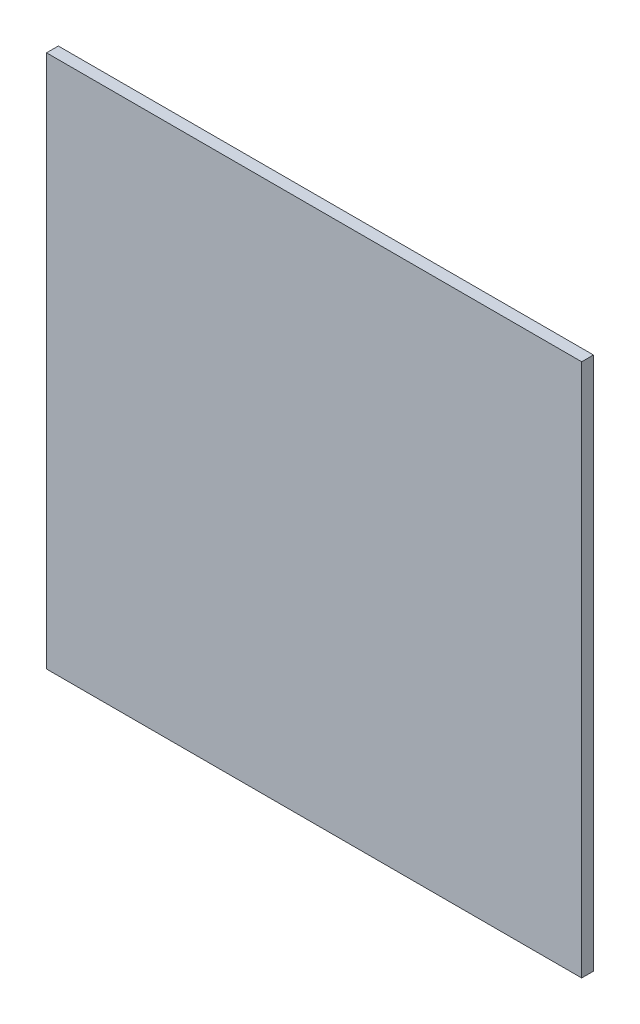
ISO-10303-21;
HEADER;
FILE_DESCRIPTION(('STEP AP214'),'2;1');
FILE_NAME('part.step','',(''),(''),'','','');
FILE_SCHEMA(('AUTOMOTIVE_DESIGN { 1 0 10303 214 1 1 1 1 }'));
ENDSEC;
DATA;
#1=APPLICATION_CONTEXT('core data for automotive mechanical design processes');
#2=APPLICATION_PROTOCOL_DEFINITION('international standard','automotive_design',2000,#1);
#3=PRODUCT_CONTEXT('',#1,'mechanical');
#4=PRODUCT('Part','Part','',(#3));
#5=PRODUCT_RELATED_PRODUCT_CATEGORY('part','',(#4));
#6=PRODUCT_DEFINITION_FORMATION('','',#4);
#7=PRODUCT_DEFINITION_CONTEXT('part definition',#1,'design');
#8=PRODUCT_DEFINITION('design','',#6,#7);
#9=PRODUCT_DEFINITION_SHAPE('','',#8);
#10=(LENGTH_UNIT() NAMED_UNIT(*) SI_UNIT(.MILLI.,.METRE.));
#11=(NAMED_UNIT(*) PLANE_ANGLE_UNIT() SI_UNIT($,.RADIAN.));
#12=(NAMED_UNIT(*) SI_UNIT($,.STERADIAN.) SOLID_ANGLE_UNIT());
#13=UNCERTAINTY_MEASURE_WITH_UNIT(LENGTH_MEASURE(1.E-05),#10,'distance_accuracy_value','');
#14=(GEOMETRIC_REPRESENTATION_CONTEXT(3) GLOBAL_UNCERTAINTY_ASSIGNED_CONTEXT((#13)) GLOBAL_UNIT_ASSIGNED_CONTEXT((#10,
#11,#12)) REPRESENTATION_CONTEXT('',''));
#15=CARTESIAN_POINT('',(0.,0.,0.));
#16=DIRECTION('',(0.,0.,1.));
#17=DIRECTION('',(1.,0.,0.));
#18=AXIS2_PLACEMENT_3D('',#15,#16,#17);
#19=CARTESIAN_POINT('',(0.,0.,0.2));
#20=DIRECTION('',(0.,0.,1.));
#21=DIRECTION('',(1.,0.,0.));
#22=AXIS2_PLACEMENT_3D('',#19,#20,#21);
#23=PLANE('',#22);
#24=DIRECTION('',(1.,0.,0.));
#25=VECTOR('',#24,1.);
#26=CARTESIAN_POINT('',(4.5405,4.528,0.2));
#27=LINE('',#26,#25);
#28=CARTESIAN_POINT('',(-4.5405,4.528,0.2));
#29=VERTEX_POINT('',#28);
#30=CARTESIAN_POINT('',(4.5405,4.528,0.2));
#31=VERTEX_POINT('',#30);
#32=EDGE_CURVE('E67',#29,#31,#27,.T.);
#33=ORIENTED_EDGE('',*,*,#32,.F.);
#34=DIRECTION('',(0.,1.,0.));
#35=VECTOR('',#34,1.);
#36=CARTESIAN_POINT('',(-4.5405,4.528,0.2));
#37=LINE('',#36,#35);
#38=CARTESIAN_POINT('',(-4.5405,-4.528,0.2));
#39=VERTEX_POINT('',#38);
#40=EDGE_CURVE('E19',#39,#29,#37,.T.);
#41=ORIENTED_EDGE('',*,*,#40,.F.);
#42=DIRECTION('',(1.,0.,0.));
#43=VECTOR('',#42,1.);
#44=CARTESIAN_POINT('',(-4.5405,-4.528,0.2));
#45=LINE('',#44,#43);
#46=CARTESIAN_POINT('',(4.5405,-4.528,0.2));
#47=VERTEX_POINT('',#46);
#48=EDGE_CURVE('E57',#47,#39,#45,.F.);
#49=ORIENTED_EDGE('',*,*,#48,.F.);
#50=DIRECTION('',(0.,1.,0.));
#51=VECTOR('',#50,1.);
#52=CARTESIAN_POINT('',(4.5405,-4.528,0.2));
#53=LINE('',#52,#51);
#54=EDGE_CURVE('E52',#31,#47,#53,.F.);
#55=ORIENTED_EDGE('',*,*,#54,.F.);
#56=EDGE_LOOP('',(#33,#41,#49,#55));
#57=FACE_BOUND('',#56,.T.);
#58=ADVANCED_FACE('F16',(#57),#23,.T.);
#59=CARTESIAN_POINT('',(-4.5405,4.528,0.));
#60=DIRECTION('',(-1.,0.,0.));
#61=DIRECTION('',(0.,0.,1.));
#62=AXIS2_PLACEMENT_3D('',#59,#60,#61);
#63=PLANE('',#62);
#64=DIRECTION('',(0.,0.,1.));
#65=VECTOR('',#64,1.);
#66=CARTESIAN_POINT('',(-4.5405,4.528,0.));
#67=LINE('',#66,#65);
#68=CARTESIAN_POINT('',(-4.5405,4.528,0.));
#69=VERTEX_POINT('',#68);
#70=EDGE_CURVE('E78',#69,#29,#67,.T.);
#71=ORIENTED_EDGE('',*,*,#70,.F.);
#72=DIRECTION('',(0.,1.,0.));
#73=VECTOR('',#72,1.);
#74=CARTESIAN_POINT('',(-4.5405,0.,0.));
#75=LINE('',#74,#73);
#76=CARTESIAN_POINT('',(-4.5405,-4.528,0.));
#77=VERTEX_POINT('',#76);
#78=EDGE_CURVE('E73',#69,#77,#75,.F.);
#79=ORIENTED_EDGE('',*,*,#78,.T.);
#80=DIRECTION('',(0.,0.,-1.));
#81=VECTOR('',#80,1.);
#82=CARTESIAN_POINT('',(-4.5405,-4.528,0.));
#83=LINE('',#82,#81);
#84=EDGE_CURVE('E62',#39,#77,#83,.T.);
#85=ORIENTED_EDGE('',*,*,#84,.F.);
#86=ORIENTED_EDGE('',*,*,#40,.T.);
#87=EDGE_LOOP('',(#71,#79,#85,#86));
#88=FACE_BOUND('',#87,.T.);
#89=ADVANCED_FACE('F72',(#88),#63,.T.);
#90=CARTESIAN_POINT('',(-4.5405,-4.528,0.));
#91=DIRECTION('',(0.,-1.,0.));
#92=DIRECTION('',(0.,0.,-1.));
#93=AXIS2_PLACEMENT_3D('',#90,#91,#92);
#94=PLANE('',#93);
#95=ORIENTED_EDGE('',*,*,#84,.T.);
#96=DIRECTION('',(1.,0.,0.));
#97=VECTOR('',#96,1.);
#98=CARTESIAN_POINT('',(0.,-4.528,0.));
#99=LINE('',#98,#97);
#100=CARTESIAN_POINT('',(4.5405,-4.528,0.));
#101=VERTEX_POINT('',#100);
#102=EDGE_CURVE('E83',#77,#101,#99,.T.);
#103=ORIENTED_EDGE('',*,*,#102,.T.);
#104=DIRECTION('',(0.,0.,-1.));
#105=VECTOR('',#104,1.);
#106=CARTESIAN_POINT('',(4.5405,-4.528,0.));
#107=LINE('',#106,#105);
#108=EDGE_CURVE('E64',#47,#101,#107,.T.);
#109=ORIENTED_EDGE('',*,*,#108,.F.);
#110=ORIENTED_EDGE('',*,*,#48,.T.);
#111=EDGE_LOOP('',(#95,#103,#109,#110));
#112=FACE_BOUND('',#111,.T.);
#113=ADVANCED_FACE('F59',(#112),#94,.T.);
#114=CARTESIAN_POINT('',(4.5405,-4.528,0.));
#115=DIRECTION('',(1.,0.,0.));
#116=DIRECTION('',(0.,0.,-1.));
#117=AXIS2_PLACEMENT_3D('',#114,#115,#116);
#118=PLANE('',#117);
#119=ORIENTED_EDGE('',*,*,#108,.T.);
#120=DIRECTION('',(0.,1.,0.));
#121=VECTOR('',#120,1.);
#122=CARTESIAN_POINT('',(4.5405,0.,0.));
#123=LINE('',#122,#121);
#124=CARTESIAN_POINT('',(4.5405,4.528,0.));
#125=VERTEX_POINT('',#124);
#126=EDGE_CURVE('E25',#101,#125,#123,.T.);
#127=ORIENTED_EDGE('',*,*,#126,.T.);
#128=DIRECTION('',(0.,0.,1.));
#129=VECTOR('',#128,1.);
#130=CARTESIAN_POINT('',(4.5405,4.528,0.));
#131=LINE('',#130,#129);
#132=EDGE_CURVE('E33',#31,#125,#131,.F.);
#133=ORIENTED_EDGE('',*,*,#132,.F.);
#134=ORIENTED_EDGE('',*,*,#54,.T.);
#135=EDGE_LOOP('',(#119,#127,#133,#134));
#136=FACE_BOUND('',#135,.T.);
#137=ADVANCED_FACE('F87',(#136),#118,.T.);
#138=CARTESIAN_POINT('',(4.5405,4.528,0.));
#139=DIRECTION('',(0.,1.,0.));
#140=DIRECTION('',(0.,0.,1.));
#141=AXIS2_PLACEMENT_3D('',#138,#139,#140);
#142=PLANE('',#141);
#143=ORIENTED_EDGE('',*,*,#132,.T.);
#144=DIRECTION('',(1.,0.,0.));
#145=VECTOR('',#144,1.);
#146=CARTESIAN_POINT('',(0.,4.528,0.));
#147=LINE('',#146,#145);
#148=EDGE_CURVE('E11',#125,#69,#147,.F.);
#149=ORIENTED_EDGE('',*,*,#148,.T.);
#150=ORIENTED_EDGE('',*,*,#70,.T.);
#151=ORIENTED_EDGE('',*,*,#32,.T.);
#152=EDGE_LOOP('',(#143,#149,#150,#151));
#153=FACE_BOUND('',#152,.T.);
#154=ADVANCED_FACE('F90',(#153),#142,.T.);
#155=CARTESIAN_POINT('',(0.,0.,0.));
#156=DIRECTION('',(0.,0.,1.));
#157=DIRECTION('',(1.,0.,0.));
#158=AXIS2_PLACEMENT_3D('',#155,#156,#157);
#159=PLANE('',#158);
#160=ORIENTED_EDGE('',*,*,#126,.F.);
#161=ORIENTED_EDGE('',*,*,#102,.F.);
#162=ORIENTED_EDGE('',*,*,#78,.F.);
#163=ORIENTED_EDGE('',*,*,#148,.F.);
#164=EDGE_LOOP('',(#160,#161,#162,#163));
#165=FACE_BOUND('',#164,.T.);
#166=ADVANCED_FACE('F89',(#165),#159,.F.);
#167=CLOSED_SHELL('',(#58,#89,#113,#137,#154,#166));
#168=MANIFOLD_SOLID_BREP('B1',#167);
#169=ADVANCED_BREP_SHAPE_REPRESENTATION('',(#18,#168),#14);
#170=SHAPE_DEFINITION_REPRESENTATION(#9,#169);
ENDSEC;
END-ISO-10303-21;
